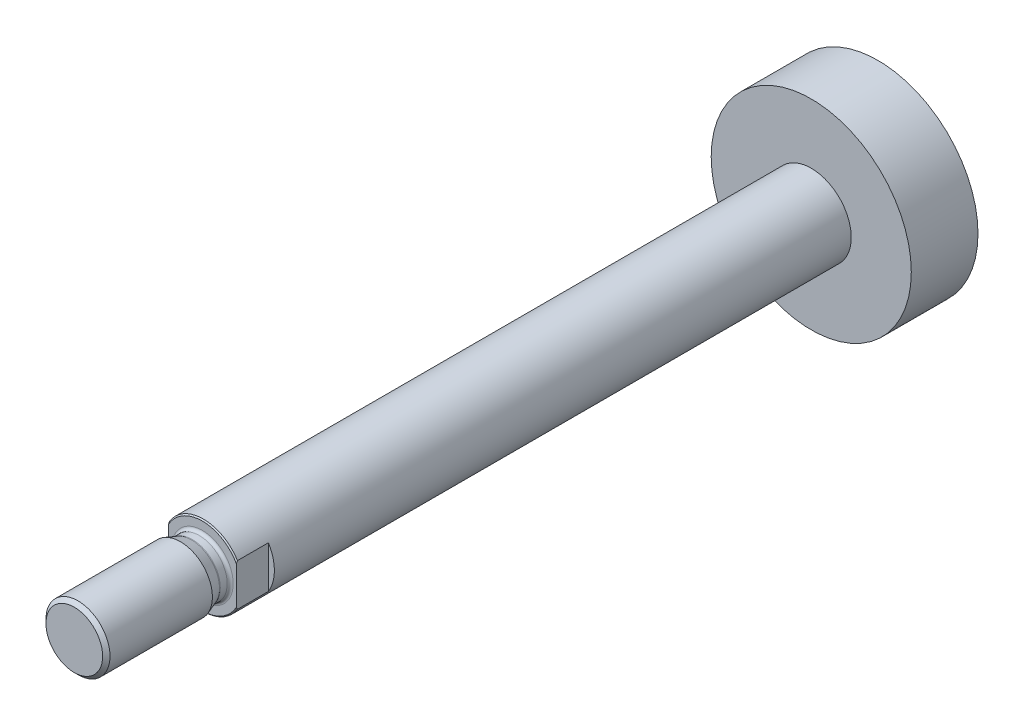
ISO-10303-21;
HEADER;
FILE_DESCRIPTION(('STEP AP214'),'2;1');
FILE_NAME('part.step','',(''),(''),'','','');
FILE_SCHEMA(('AUTOMOTIVE_DESIGN { 1 0 10303 214 1 1 1 1 }'));
ENDSEC;
DATA;
#1=APPLICATION_CONTEXT('core data for automotive mechanical design processes');
#2=APPLICATION_PROTOCOL_DEFINITION('international standard','automotive_design',2000,#1);
#3=PRODUCT_CONTEXT('',#1,'mechanical');
#4=PRODUCT('Part','Part','',(#3));
#5=PRODUCT_RELATED_PRODUCT_CATEGORY('part','',(#4));
#6=PRODUCT_DEFINITION_FORMATION('','',#4);
#7=PRODUCT_DEFINITION_CONTEXT('part definition',#1,'design');
#8=PRODUCT_DEFINITION('design','',#6,#7);
#9=PRODUCT_DEFINITION_SHAPE('','',#8);
#10=(LENGTH_UNIT() NAMED_UNIT(*) SI_UNIT(.MILLI.,.METRE.));
#11=(NAMED_UNIT(*) PLANE_ANGLE_UNIT() SI_UNIT($,.RADIAN.));
#12=(NAMED_UNIT(*) SI_UNIT($,.STERADIAN.) SOLID_ANGLE_UNIT());
#13=UNCERTAINTY_MEASURE_WITH_UNIT(LENGTH_MEASURE(1.E-05),#10,'distance_accuracy_value','');
#14=(GEOMETRIC_REPRESENTATION_CONTEXT(3) GLOBAL_UNCERTAINTY_ASSIGNED_CONTEXT((#13)) GLOBAL_UNIT_ASSIGNED_CONTEXT((#10,
#11,#12)) REPRESENTATION_CONTEXT('',''));
#15=CARTESIAN_POINT('',(0.,0.,0.));
#16=DIRECTION('',(0.,0.,1.));
#17=DIRECTION('',(1.,0.,0.));
#18=AXIS2_PLACEMENT_3D('',#15,#16,#17);
#19=CARTESIAN_POINT('',(0.,0.,35.8));
#20=DIRECTION('',(0.,0.,-1.));
#21=DIRECTION('',(-1.,0.,0.));
#22=AXIS2_PLACEMENT_3D('',#19,#20,#21);
#23=PLANE('',#22);
#24=CARTESIAN_POINT('',(0.,0.,35.8));
#25=DIRECTION('',(0.,0.,1.));
#26=DIRECTION('',(1.,0.,0.));
#27=AXIS2_PLACEMENT_3D('',#24,#25,#26);
#28=CIRCLE('',#27,9.7171572875254);
#29=CARTESIAN_POINT('',(8.5,4.70883698491549,35.8));
#30=VERTEX_POINT('',#29);
#31=CARTESIAN_POINT('',(-8.5,4.70883698491549,35.8));
#32=VERTEX_POINT('',#31);
#33=EDGE_CURVE('E93',#30,#32,#28,.T.);
#34=ORIENTED_EDGE('',*,*,#33,.T.);
#35=DIRECTION('',(0.,-1.,0.));
#36=VECTOR('',#35,1.);
#37=CARTESIAN_POINT('',(-8.5,0.,35.8));
#38=LINE('',#37,#36);
#39=CARTESIAN_POINT('',(-8.5,-4.70883698491549,35.8));
#40=VERTEX_POINT('',#39);
#41=EDGE_CURVE('E135',#32,#40,#38,.T.);
#42=ORIENTED_EDGE('',*,*,#41,.T.);
#43=CARTESIAN_POINT('',(8.5,-4.70883698491549,35.8));
#44=VERTEX_POINT('',#43);
#45=EDGE_CURVE('E123',#40,#44,#28,.T.);
#46=ORIENTED_EDGE('',*,*,#45,.T.);
#47=DIRECTION('',(0.,1.,0.));
#48=VECTOR('',#47,1.);
#49=CARTESIAN_POINT('',(8.5,0.,35.8));
#50=LINE('',#49,#48);
#51=EDGE_CURVE('E137',#44,#30,#50,.T.);
#52=ORIENTED_EDGE('',*,*,#51,.T.);
#53=EDGE_LOOP('',(#34,#42,#46,#52));
#54=FACE_BOUND('',#53,.T.);
#55=CARTESIAN_POINT('',(0.,0.,35.8));
#56=DIRECTION('',(0.,0.,1.));
#57=DIRECTION('',(1.,0.,0.));
#58=AXIS2_PLACEMENT_3D('',#55,#56,#57);
#59=CIRCLE('',#58,7.69999999999987);
#60=CARTESIAN_POINT('',(7.69999999999987,0.,35.8));
#61=VERTEX_POINT('',#60);
#62=EDGE_CURVE('E11',#61,#61,#59,.T.);
#63=ORIENTED_EDGE('',*,*,#62,.F.);
#64=EDGE_LOOP('',(#63));
#65=FACE_BOUND('',#64,.T.);
#66=ADVANCED_FACE('F37',(#54,#65),#23,.F.);
#67=CARTESIAN_POINT('',(0.,0.,35.517157287525));
#68=DIRECTION('',(0.,0.,-1.));
#69=DIRECTION('',(-1.,0.,0.));
#70=AXIS2_PLACEMENT_3D('',#67,#68,#69);
#71=CONICAL_SURFACE('',#70,10.,0.78539816339674);
#72=CARTESIAN_POINT('',(0.,0.,35.517157287525));
#73=DIRECTION('',(0.,0.,1.));
#74=DIRECTION('',(1.,0.,0.));
#75=AXIS2_PLACEMENT_3D('',#72,#73,#74);
#76=CIRCLE('',#75,10.);
#77=CARTESIAN_POINT('',(8.5,5.26782687642637,35.517157287525));
#78=VERTEX_POINT('',#77);
#79=CARTESIAN_POINT('',(-8.5,5.26782687642637,35.517157287525));
#80=VERTEX_POINT('',#79);
#81=EDGE_CURVE('E107',#78,#80,#76,.T.);
#82=ORIENTED_EDGE('',*,*,#81,.T.);
#83=CARTESIAN_POINT('',(-8.5,20.2931416818429,23.515757347519));
#84=CARTESIAN_POINT('',(-8.5,19.9909532321816,23.7944751985551));
#85=CARTESIAN_POINT('',(-8.5,19.6883087592429,24.0726995764812));
#86=CARTESIAN_POINT('',(-8.5,19.0819693919795,24.6280057982693));
#87=CARTESIAN_POINT('',(-8.5,18.7782744897062,24.9050876334509));
#88=CARTESIAN_POINT('',(-8.5,18.1696326441628,25.4580105647202));
#89=CARTESIAN_POINT('',(-8.5,17.8646854369076,25.7338513704878));
#90=CARTESIAN_POINT('',(-8.5,17.2534360991885,26.2840248711402));
#91=CARTESIAN_POINT('',(-8.5,16.9471339714415,26.5583575690466));
#92=CARTESIAN_POINT('',(-8.5,16.022231094719,27.3820416740625));
#93=CARTESIAN_POINT('',(-8.5,15.4012748222079,27.9287620268451));
#94=CARTESIAN_POINT('',(-8.5,14.4635790899891,28.7415486402703));
#95=CARTESIAN_POINT('',(-8.5,14.1499869172972,29.0112478932061));
#96=CARTESIAN_POINT('',(-8.5,13.5203299168492,29.5477463030765));
#97=CARTESIAN_POINT('',(-8.5,13.2042651003595,29.814545473212));
#98=CARTESIAN_POINT('',(-8.5,12.6297734485833,30.2941094729629));
#99=CARTESIAN_POINT('',(-8.5,12.3718491936014,30.507476120676));
#100=CARTESIAN_POINT('',(-8.5,11.8538066740541,30.9315279775631));
#101=CARTESIAN_POINT('',(-8.5,11.5936884275092,31.1422132087254));
#102=CARTESIAN_POINT('',(-8.5,11.0708475228822,31.5604725773241));
#103=CARTESIAN_POINT('',(-8.5,10.8081242003524,31.7680458852602));
#104=CARTESIAN_POINT('',(-8.5,10.2797334506629,32.1794132002756));
#105=CARTESIAN_POINT('',(-8.5,10.0140660451895,32.3832072351634));
#106=CARTESIAN_POINT('',(-8.5,9.47958475304092,32.7860262182236));
#107=CARTESIAN_POINT('',(-8.5,9.21077459368648,32.9850561016856));
#108=CARTESIAN_POINT('',(-8.5,8.66912744527886,33.3775966541487));
#109=CARTESIAN_POINT('',(-8.5,8.39629029886536,33.571107106599));
#110=CARTESIAN_POINT('',(-8.5,7.84601626840109,33.9512419480706));
#111=CARTESIAN_POINT('',(-8.5,7.56858139513418,34.1378692379163));
#112=CARTESIAN_POINT('',(-8.5,7.00820580406143,34.5026353654442));
#113=CARTESIAN_POINT('',(-8.5,6.72526571129147,34.6807751589265));
#114=CARTESIAN_POINT('',(-8.5,6.15594369522947,35.0245556092062));
#115=CARTESIAN_POINT('',(-8.5,5.86963011329933,35.1903088027741));
#116=CARTESIAN_POINT('',(-8.5,5.28964170919473,35.5085847634925));
#117=CARTESIAN_POINT('',(-8.5,4.99596607971788,35.6611060714174));
#118=CARTESIAN_POINT('',(-8.5,4.40060972911149,35.9491091194768));
#119=CARTESIAN_POINT('',(-8.5,4.09893609408879,36.0846053703257));
#120=CARTESIAN_POINT('',(-8.5,3.48675946894252,36.3340497452572));
#121=CARTESIAN_POINT('',(-8.5,3.17625906988089,36.4480041192478));
#122=CARTESIAN_POINT('',(-8.5,2.61483993494601,36.6271172168644));
#123=CARTESIAN_POINT('',(-8.5,2.36559695435784,36.6974987360869));
#124=CARTESIAN_POINT('',(-8.5,1.86241147061954,36.8189376790285));
#125=CARTESIAN_POINT('',(-8.5,1.60846958490582,36.8699976229546));
#126=CARTESIAN_POINT('',(-8.5,1.09789808538753,36.9502405878037));
#127=CARTESIAN_POINT('',(-8.5,0.841279054154406,36.9794899738951));
#128=CARTESIAN_POINT('',(-8.5,0.326434251534695,37.0147672549925));
#129=CARTESIAN_POINT('',(-8.5,0.0682085522656415,37.0207961848559));
#130=CARTESIAN_POINT('',(-8.5,-0.448145416818584,37.0092732790622));
#131=CARTESIAN_POINT('',(-8.5,-0.70627278006227,36.9916814678556));
#132=CARTESIAN_POINT('',(-8.5,-1.21995794283295,36.933852765241));
#133=CARTESIAN_POINT('',(-8.5,-1.47551552737386,36.8936139949842));
#134=CARTESIAN_POINT('',(-8.5,-1.98325104270918,36.7924134805502));
#135=CARTESIAN_POINT('',(-8.5,-2.23541619910096,36.7313885363896));
#136=CARTESIAN_POINT('',(-8.5,-2.73462740984317,36.5913102607832));
#137=CARTESIAN_POINT('',(-8.5,-2.98167333960936,36.512256491139));
#138=CARTESIAN_POINT('',(-8.5,-3.50843039200757,36.3253505755926));
#139=CARTESIAN_POINT('',(-8.5,-3.78722327825603,36.214929559187));
#140=CARTESIAN_POINT('',(-8.5,-4.3377344352971,35.9775449304102));
#141=CARTESIAN_POINT('',(-8.5,-4.60944947813715,35.8505739233482));
#142=CARTESIAN_POINT('',(-8.5,-5.14670936977727,35.5831632290464));
#143=CARTESIAN_POINT('',(-8.5,-5.41224263972401,35.442700453981));
#144=CARTESIAN_POINT('',(-8.5,-5.93732373883573,35.1511479577253));
#145=CARTESIAN_POINT('',(-8.5,-6.19687237682952,35.0000596838929));
#146=CARTESIAN_POINT('',(-8.5,-6.71387938945896,34.6874165964138));
#147=CARTESIAN_POINT('',(-8.5,-6.97127405537464,34.5257569209253));
#148=CARTESIAN_POINT('',(-8.5,-7.48143909140267,34.1953123208713));
#149=CARTESIAN_POINT('',(-8.5,-7.73420934795835,34.0265272216701));
#150=CARTESIAN_POINT('',(-8.5,-8.23548894286409,33.6833095797488));
#151=CARTESIAN_POINT('',(-8.5,-8.48400243239181,33.50888308204));
#152=CARTESIAN_POINT('',(-8.5,-8.97759015318394,33.1552198479554));
#153=CARTESIAN_POINT('',(-8.5,-9.22266424062535,32.9759829113324));
#154=CARTESIAN_POINT('',(-8.5,-9.71078642617633,32.6127907239817));
#155=CARTESIAN_POINT('',(-8.5,-9.95382274811321,32.4288196744052));
#156=CARTESIAN_POINT('',(-8.5,-10.4372856320122,32.0574761238702));
#157=CARTESIAN_POINT('',(-8.5,-10.6777121405458,31.8701035534842));
#158=CARTESIAN_POINT('',(-8.5,-11.3956270119042,31.3036586987104));
#159=CARTESIAN_POINT('',(-8.5,-11.869720195856,30.9202821895857));
#160=CARTESIAN_POINT('',(-8.5,-12.8113091720547,30.1448280086789));
#161=CARTESIAN_POINT('',(-8.5,-13.2787996354372,29.7527438999839));
#162=CARTESIAN_POINT('',(-8.5,-14.208345382449,28.9621780256675));
#163=CARTESIAN_POINT('',(-8.5,-14.6704005643826,28.5636961406705));
#164=CARTESIAN_POINT('',(-8.5,-15.5669685578594,27.7820273007353));
#165=CARTESIAN_POINT('',(-8.5,-16.0016941293626,27.3990838847463));
#166=CARTESIAN_POINT('',(-8.5,-16.8679762920894,26.6296198506874));
#167=CARTESIAN_POINT('',(-8.5,-17.2995328365647,26.2430991800366));
#168=CARTESIAN_POINT('',(-8.5,-18.1593436587441,25.4677882494832));
#169=CARTESIAN_POINT('',(-8.5,-18.5876021265765,25.0790026310551));
#170=CARTESIAN_POINT('',(-8.5,-19.4419161824545,24.2990487562217));
#171=CARTESIAN_POINT('',(-8.5,-19.8679718499217,23.9078805868421));
#172=CARTESIAN_POINT('',(-8.5,-20.2931416818429,23.515757347519));
#173=B_SPLINE_CURVE_WITH_KNOTS('',3,(#83,#84,#85,#86,#87,#88,#89,#90,#91,#92,#93,#94,#95,#96,
#97,#98,#99,#100,#101,#102,#103,#104,#105,#106,#107,#108,#109,#110,#111,#112,#113,#114,#115,
#116,#117,#118,#119,#120,#121,#122,#123,#124,#125,#126,#127,#128,#129,#130,#131,#132,#133,#134,
#135,#136,#137,#138,#139,#140,#141,#142,#143,#144,#145,#146,#147,#148,#149,#150,#151,#152,#153,
#154,#155,#156,#157,#158,#159,#160,#161,#162,#163,#164,#165,#166,#167,#168,#169,#170,#171,#172),
.UNSPECIFIED.,.F.,.F.,(4,2,2,2,2,2,2,2,2,2,2,2,2,2,2,2,2,2,2,2,2,2,2,2,2,2,2,2,2,2,2,2,2,2,2,2,
2,2,2,2,2,2,2,2,4),(0.,1.23329407253443,2.46659749779148,3.70017581984493,4.93375166947324,
7.41567899242222,8.65651239378964,9.89734014467006,10.9015425300175,11.9057366753115,
12.9101938980808,13.9146437269081,14.9180035554603,15.9214026960937,16.9243740186242,
17.9272321255532,18.9194528406654,19.9117828401383,20.9032612403211,21.894451541599,
22.6707670326658,23.4469812301961,24.220823815752,24.9946319133493,25.7697512494663,
26.54493490092,27.3224968404886,28.1000776810491,28.9989943325069,29.8983140140338,
30.7992010482207,31.6999656044036,32.6116741068261,33.5234049671282,34.4341892823292,
35.3450115703387,36.2594200447435,37.1738472038835,39.0028160017244,40.8331850617722,
42.6635883142871,44.4015778846082,46.1395930417847,47.8748171514288,49.6099782553031),.UNSPECIFIED.);
#174=EDGE_CURVE('E120',#80,#32,#173,.T.);
#175=ORIENTED_EDGE('',*,*,#174,.T.);
#176=ORIENTED_EDGE('',*,*,#33,.F.);
#177=CARTESIAN_POINT('',(8.5,-20.2931416818428,23.515757347519));
#178=CARTESIAN_POINT('',(8.5,-19.9909532321816,23.7944751985551));
#179=CARTESIAN_POINT('',(8.5,-19.6883087592429,24.0726995764812));
#180=CARTESIAN_POINT('',(8.5,-19.0819693919795,24.6280057982693));
#181=CARTESIAN_POINT('',(8.5,-18.7782744897062,24.9050876334509));
#182=CARTESIAN_POINT('',(8.5,-18.1696326441628,25.4580105647202));
#183=CARTESIAN_POINT('',(8.5,-17.8646854369076,25.7338513704878));
#184=CARTESIAN_POINT('',(8.5,-17.2534360991885,26.2840248711402));
#185=CARTESIAN_POINT('',(8.5,-16.9471339714415,26.5583575690466));
#186=CARTESIAN_POINT('',(8.5,-16.022231094719,27.3820416740625));
#187=CARTESIAN_POINT('',(8.5,-15.4012748222079,27.9287620268451));
#188=CARTESIAN_POINT('',(8.5,-14.4635790899891,28.7415486402703));
#189=CARTESIAN_POINT('',(8.5,-14.1499869172972,29.0112478932061));
#190=CARTESIAN_POINT('',(8.5,-13.5203299168492,29.5477463030765));
#191=CARTESIAN_POINT('',(8.5,-13.2042651003595,29.814545473212));
#192=CARTESIAN_POINT('',(8.5,-12.6297734485833,30.2941094729629));
#193=CARTESIAN_POINT('',(8.5,-12.3718491936014,30.507476120676));
#194=CARTESIAN_POINT('',(8.5,-11.8538066740541,30.9315279775631));
#195=CARTESIAN_POINT('',(8.5,-11.5936884275093,31.1422132087254));
#196=CARTESIAN_POINT('',(8.5,-11.0708475228822,31.560472577324));
#197=CARTESIAN_POINT('',(8.5,-10.8081242003524,31.7680458852602));
#198=CARTESIAN_POINT('',(8.5,-10.279733450663,32.1794132002755));
#199=CARTESIAN_POINT('',(8.5,-10.0140660451895,32.3832072351633));
#200=CARTESIAN_POINT('',(8.5,-9.47958475304094,32.7860262182236));
#201=CARTESIAN_POINT('',(8.5,-9.2107745936865,32.9850561016856));
#202=CARTESIAN_POINT('',(8.5,-8.66912744527887,33.3775966541487));
#203=CARTESIAN_POINT('',(8.5,-8.39629029886538,33.571107106599));
#204=CARTESIAN_POINT('',(8.5,-7.84601626840112,33.9512419480706));
#205=CARTESIAN_POINT('',(8.5,-7.56858139513421,34.1378692379163));
#206=CARTESIAN_POINT('',(8.5,-7.00820580406146,34.5026353654441));
#207=CARTESIAN_POINT('',(8.5,-6.7252657112915,34.6807751589265));
#208=CARTESIAN_POINT('',(8.5,-6.15594369522951,35.0245556092062));
#209=CARTESIAN_POINT('',(8.5,-5.86963011329937,35.1903088027741));
#210=CARTESIAN_POINT('',(8.5,-5.28964170919476,35.5085847634925));
#211=CARTESIAN_POINT('',(8.5,-4.99596607971791,35.6611060714174));
#212=CARTESIAN_POINT('',(8.5,-4.40060972911151,35.9491091194768));
#213=CARTESIAN_POINT('',(8.5,-4.09893609408881,36.0846053703257));
#214=CARTESIAN_POINT('',(8.5,-3.48675946894254,36.3340497452572));
#215=CARTESIAN_POINT('',(8.5,-3.17625906988091,36.4480041192478));
#216=CARTESIAN_POINT('',(8.5,-2.61483993494603,36.6271172168644));
#217=CARTESIAN_POINT('',(8.5,-2.36559695435785,36.6974987360869));
#218=CARTESIAN_POINT('',(8.5,-1.86241147061956,36.8189376790285));
#219=CARTESIAN_POINT('',(8.5,-1.60846958490584,36.8699976229546));
#220=CARTESIAN_POINT('',(8.5,-1.09789808538755,36.9502405878037));
#221=CARTESIAN_POINT('',(8.5,-0.841279054154421,36.9794899738951));
#222=CARTESIAN_POINT('',(8.5,-0.326434251534708,37.0147672549924));
#223=CARTESIAN_POINT('',(8.5,-0.0682085522656554,37.0207961848559));
#224=CARTESIAN_POINT('',(8.5,0.448145416818571,37.0092732790622));
#225=CARTESIAN_POINT('',(8.5,0.706272780062258,36.9916814678556));
#226=CARTESIAN_POINT('',(8.5,1.21995794283294,36.933852765241));
#227=CARTESIAN_POINT('',(8.5,1.47551552737385,36.8936139949842));
#228=CARTESIAN_POINT('',(8.5,1.98325104270917,36.7924134805502));
#229=CARTESIAN_POINT('',(8.5,2.23541619910094,36.7313885363896));
#230=CARTESIAN_POINT('',(8.5,2.73462740984316,36.5913102607832));
#231=CARTESIAN_POINT('',(8.5,2.98167333960935,36.512256491139));
#232=CARTESIAN_POINT('',(8.5,3.50843039200756,36.3253505755926));
#233=CARTESIAN_POINT('',(8.5,3.78722327825601,36.214929559187));
#234=CARTESIAN_POINT('',(8.5,4.33773443529708,35.9775449304102));
#235=CARTESIAN_POINT('',(8.5,4.60944947813713,35.8505739233482));
#236=CARTESIAN_POINT('',(8.5,5.14670936977725,35.5831632290464));
#237=CARTESIAN_POINT('',(8.5,5.412242639724,35.4427004539811));
#238=CARTESIAN_POINT('',(8.5,5.93732373883572,35.1511479577253));
#239=CARTESIAN_POINT('',(8.5,6.1968723768295,35.000059683893));
#240=CARTESIAN_POINT('',(8.5,6.71387938945894,34.6874165964138));
#241=CARTESIAN_POINT('',(8.5,6.97127405537462,34.5257569209253));
#242=CARTESIAN_POINT('',(8.5,7.48143909140265,34.1953123208713));
#243=CARTESIAN_POINT('',(8.5,7.73420934795833,34.0265272216701));
#244=CARTESIAN_POINT('',(8.5,8.23548894286407,33.6833095797489));
#245=CARTESIAN_POINT('',(8.5,8.48400243239178,33.50888308204));
#246=CARTESIAN_POINT('',(8.5,8.97759015318391,33.1552198479554));
#247=CARTESIAN_POINT('',(8.5,9.22266424062532,32.9759829113324));
#248=CARTESIAN_POINT('',(8.5,9.7107864261763,32.6127907239817));
#249=CARTESIAN_POINT('',(8.5,9.95382274811318,32.4288196744052));
#250=CARTESIAN_POINT('',(8.5,10.4372856320122,32.0574761238702));
#251=CARTESIAN_POINT('',(8.5,10.6777121405458,31.8701035534843));
#252=CARTESIAN_POINT('',(8.5,11.3956270119042,31.3036586987104));
#253=CARTESIAN_POINT('',(8.5,11.869720195856,30.9202821895857));
#254=CARTESIAN_POINT('',(8.5,12.8113091720547,30.1448280086789));
#255=CARTESIAN_POINT('',(8.5,13.2787996354371,29.7527438999839));
#256=CARTESIAN_POINT('',(8.5,14.208345382449,28.9621780256675));
#257=CARTESIAN_POINT('',(8.5,14.6704005643825,28.5636961406705));
#258=CARTESIAN_POINT('',(8.5,15.5669685578594,27.7820273007354));
#259=CARTESIAN_POINT('',(8.5,16.0016941293626,27.3990838847463));
#260=CARTESIAN_POINT('',(8.5,16.8679762920894,26.6296198506874));
#261=CARTESIAN_POINT('',(8.5,17.2995328365647,26.2430991800366));
#262=CARTESIAN_POINT('',(8.5,18.1593436587441,25.4677882494832));
#263=CARTESIAN_POINT('',(8.5,18.5876021265765,25.0790026310551));
#264=CARTESIAN_POINT('',(8.5,19.4419161824545,24.2990487562217));
#265=CARTESIAN_POINT('',(8.5,19.8679718499217,23.9078805868421));
#266=CARTESIAN_POINT('',(8.5,20.2931416818429,23.515757347519));
#267=B_SPLINE_CURVE_WITH_KNOTS('',3,(#177,#178,#179,#180,#181,#182,#183,#184,#185,#186,#187,
#188,#189,#190,#191,#192,#193,#194,#195,#196,#197,#198,#199,#200,#201,#202,#203,#204,#205,#206,
#207,#208,#209,#210,#211,#212,#213,#214,#215,#216,#217,#218,#219,#220,#221,#222,#223,#224,#225,
#226,#227,#228,#229,#230,#231,#232,#233,#234,#235,#236,#237,#238,#239,#240,#241,#242,#243,#244,
#245,#246,#247,#248,#249,#250,#251,#252,#253,#254,#255,#256,#257,#258,#259,#260,#261,#262,#263,
#264,#265,#266),.UNSPECIFIED.,.F.,.F.,(4,2,2,2,2,2,2,2,2,2,2,2,2,2,2,2,2,2,2,2,2,2,2,2,2,2,2,2,
2,2,2,2,2,2,2,2,2,2,2,2,2,2,2,2,4),(0.,1.23329407253443,2.46659749779148,3.70017581984493,
4.93375166947324,7.41567899242221,8.65651239378964,9.89734014467005,10.9015425300175,
11.9057366753115,12.9101938980808,13.9146437269081,14.9180035554602,15.9214026960937,
16.9243740186241,17.9272321255531,18.9194528406654,19.9117828401383,20.9032612403211,
21.894451541599,22.6707670326657,23.4469812301961,24.220823815752,24.9946319133493,
25.7697512494663,26.54493490092,27.3224968404885,28.1000776810491,28.9989943325069,
29.8983140140337,30.7992010482207,31.6999656044036,32.6116741068261,33.5234049671282,
34.4341892823292,35.3450115703386,36.2594200447435,37.1738472038834,39.0028160017243,
40.8331850617722,42.6635883142871,44.4015778846081,46.1395930417847,47.8748171514288,
49.6099782553031),.UNSPECIFIED.);
#268=EDGE_CURVE('E122',#30,#78,#267,.T.);
#269=ORIENTED_EDGE('',*,*,#268,.T.);
#270=EDGE_LOOP('',(#82,#175,#176,#269));
#271=FACE_BOUND('',#270,.T.);
#272=ADVANCED_FACE('F118',(#271),#71,.T.);
#273=ORIENTED_EDGE('',*,*,#45,.F.);
#274=CARTESIAN_POINT('',(-8.5,-5.26782687642637,35.517157287525));
#275=VERTEX_POINT('',#274);
#276=EDGE_CURVE('E141',#40,#275,#173,.T.);
#277=ORIENTED_EDGE('',*,*,#276,.T.);
#278=CARTESIAN_POINT('',(8.5,-5.26782687642637,35.517157287525));
#279=VERTEX_POINT('',#278);
#280=EDGE_CURVE('E124',#275,#279,#76,.T.);
#281=ORIENTED_EDGE('',*,*,#280,.T.);
#282=EDGE_CURVE('E139',#279,#44,#267,.T.);
#283=ORIENTED_EDGE('',*,*,#282,.T.);
#284=EDGE_LOOP('',(#273,#277,#281,#283));
#285=FACE_BOUND('',#284,.T.);
#286=ADVANCED_FACE('F155',(#285),#71,.T.);
#287=CARTESIAN_POINT('',(0.,0.,-133.));
#288=DIRECTION('',(0.,0.,1.));
#289=DIRECTION('',(1.,0.,0.));
#290=AXIS2_PLACEMENT_3D('',#287,#288,#289);
#291=CYLINDRICAL_SURFACE('',#290,10.);
#292=CARTESIAN_POINT('',(0.,0.,27.8));
#293=DIRECTION('',(0.,0.,-1.));
#294=DIRECTION('',(-1.,0.,0.));
#295=AXIS2_PLACEMENT_3D('',#292,#293,#294);
#296=CIRCLE('',#295,10.);
#297=CARTESIAN_POINT('',(-8.5,-5.26782687642637,27.8));
#298=VERTEX_POINT('',#297);
#299=CARTESIAN_POINT('',(-8.5,5.26782687642637,27.8));
#300=VERTEX_POINT('',#299);
#301=EDGE_CURVE('E115',#298,#300,#296,.T.);
#302=ORIENTED_EDGE('',*,*,#301,.T.);
#303=DIRECTION('',(0.,0.,1.));
#304=VECTOR('',#303,1.);
#305=CARTESIAN_POINT('',(-8.5,5.26782687642637,-133.));
#306=LINE('',#305,#304);
#307=EDGE_CURVE('E44',#300,#80,#306,.T.);
#308=ORIENTED_EDGE('',*,*,#307,.T.);
#309=ORIENTED_EDGE('',*,*,#81,.F.);
#310=DIRECTION('',(0.,0.,1.));
#311=VECTOR('',#310,1.);
#312=CARTESIAN_POINT('',(8.5,5.26782687642637,-133.));
#313=LINE('',#312,#311);
#314=CARTESIAN_POINT('',(8.5,5.26782687642637,27.8));
#315=VERTEX_POINT('',#314);
#316=EDGE_CURVE('E92',#78,#315,#313,.F.);
#317=ORIENTED_EDGE('',*,*,#316,.T.);
#318=CARTESIAN_POINT('',(0.,0.,27.8));
#319=DIRECTION('',(0.,0.,-1.));
#320=DIRECTION('',(-1.,0.,0.));
#321=AXIS2_PLACEMENT_3D('',#318,#319,#320);
#322=CIRCLE('',#321,10.);
#323=CARTESIAN_POINT('',(8.5,-5.26782687642637,27.8));
#324=VERTEX_POINT('',#323);
#325=EDGE_CURVE('E87',#315,#324,#322,.T.);
#326=ORIENTED_EDGE('',*,*,#325,.T.);
#327=DIRECTION('',(0.,0.,1.));
#328=VECTOR('',#327,1.);
#329=CARTESIAN_POINT('',(8.5,-5.26782687642637,-133.));
#330=LINE('',#329,#328);
#331=EDGE_CURVE('E98',#324,#279,#330,.T.);
#332=ORIENTED_EDGE('',*,*,#331,.T.);
#333=ORIENTED_EDGE('',*,*,#280,.F.);
#334=DIRECTION('',(0.,0.,1.));
#335=VECTOR('',#334,1.);
#336=CARTESIAN_POINT('',(-8.5,-5.26782687642637,-133.));
#337=LINE('',#336,#335);
#338=EDGE_CURVE('E109',#275,#298,#337,.F.);
#339=ORIENTED_EDGE('',*,*,#338,.T.);
#340=EDGE_LOOP('',(#302,#308,#309,#317,#326,#332,#333,#339));
#341=FACE_BOUND('',#340,.T.);
#342=CARTESIAN_POINT('',(0.,0.,-116.33333333333));
#343=DIRECTION('',(0.,0.,1.));
#344=DIRECTION('',(1.,0.,0.));
#345=AXIS2_PLACEMENT_3D('',#342,#343,#344);
#346=CIRCLE('',#345,10.);
#347=CARTESIAN_POINT('',(10.,0.,-116.33333333333));
#348=VERTEX_POINT('',#347);
#349=EDGE_CURVE('E128',#348,#348,#346,.T.);
#350=ORIENTED_EDGE('',*,*,#349,.T.);
#351=EDGE_LOOP('',(#350));
#352=FACE_BOUND('',#351,.T.);
#353=ADVANCED_FACE('F103',(#341,#352),#291,.T.);
#354=CARTESIAN_POINT('',(0.,10.,-116.33333333333));
#355=DIRECTION('',(0.,0.,-1.));
#356=DIRECTION('',(-1.,0.,0.));
#357=AXIS2_PLACEMENT_3D('',#354,#355,#356);
#358=PLANE('',#357);
#359=ORIENTED_EDGE('',*,*,#349,.F.);
#360=EDGE_LOOP('',(#359));
#361=FACE_BOUND('',#360,.T.);
#362=CARTESIAN_POINT('',(0.,0.,-116.33333333333));
#363=DIRECTION('',(0.,0.,1.));
#364=DIRECTION('',(1.,0.,0.));
#365=AXIS2_PLACEMENT_3D('',#362,#363,#364);
#366=CIRCLE('',#365,25.);
#367=CARTESIAN_POINT('',(25.,0.,-116.33333333333));
#368=VERTEX_POINT('',#367);
#369=EDGE_CURVE('E381',#368,#368,#366,.T.);
#370=ORIENTED_EDGE('',*,*,#369,.T.);
#371=EDGE_LOOP('',(#370));
#372=FACE_BOUND('',#371,.T.);
#373=ADVANCED_FACE('F177',(#361,#372),#358,.F.);
#374=CARTESIAN_POINT('',(0.,0.,-133.));
#375=DIRECTION('',(0.,0.,1.));
#376=DIRECTION('',(1.,0.,0.));
#377=AXIS2_PLACEMENT_3D('',#374,#375,#376);
#378=CYLINDRICAL_SURFACE('',#377,25.);
#379=ORIENTED_EDGE('',*,*,#369,.F.);
#380=EDGE_LOOP('',(#379));
#381=FACE_BOUND('',#380,.T.);
#382=CARTESIAN_POINT('',(0.,0.,-133.));
#383=DIRECTION('',(0.,0.,1.));
#384=DIRECTION('',(1.,0.,0.));
#385=AXIS2_PLACEMENT_3D('',#382,#383,#384);
#386=CIRCLE('',#385,25.);
#387=CARTESIAN_POINT('',(25.,0.,-133.));
#388=VERTEX_POINT('',#387);
#389=EDGE_CURVE('E379',#388,#388,#386,.T.);
#390=ORIENTED_EDGE('',*,*,#389,.T.);
#391=EDGE_LOOP('',(#390));
#392=FACE_BOUND('',#391,.T.);
#393=ADVANCED_FACE('F173',(#381,#392),#378,.T.);
#394=CARTESIAN_POINT('',(0.,25.,-133.));
#395=DIRECTION('',(0.,0.,1.));
#396=DIRECTION('',(1.,0.,0.));
#397=AXIS2_PLACEMENT_3D('',#394,#395,#396);
#398=PLANE('',#397);
#399=ORIENTED_EDGE('',*,*,#389,.F.);
#400=EDGE_LOOP('',(#399));
#401=FACE_BOUND('',#400,.T.);
#402=ADVANCED_FACE('F170',(#401),#398,.F.);
#403=CARTESIAN_POINT('',(17.,-17.,27.8));
#404=DIRECTION('',(0.,0.,-1.));
#405=DIRECTION('',(-1.,0.,0.));
#406=AXIS2_PLACEMENT_3D('',#403,#404,#405);
#407=PLANE('',#406);
#408=DIRECTION('',(0.,1.,0.));
#409=VECTOR('',#408,1.);
#410=CARTESIAN_POINT('',(8.5,-17.,27.8));
#411=LINE('',#410,#409);
#412=EDGE_CURVE('E58',#324,#315,#411,.T.);
#413=ORIENTED_EDGE('',*,*,#412,.F.);
#414=ORIENTED_EDGE('',*,*,#325,.F.);
#415=EDGE_LOOP('',(#413,#414));
#416=FACE_BOUND('',#415,.T.);
#417=ADVANCED_FACE('F88',(#416),#407,.F.);
#418=CARTESIAN_POINT('',(8.5,-17.,27.8));
#419=DIRECTION('',(-1.,0.,0.));
#420=DIRECTION('',(0.,0.,1.));
#421=AXIS2_PLACEMENT_3D('',#418,#419,#420);
#422=PLANE('',#421);
#423=ORIENTED_EDGE('',*,*,#412,.T.);
#424=ORIENTED_EDGE('',*,*,#316,.F.);
#425=ORIENTED_EDGE('',*,*,#268,.F.);
#426=ORIENTED_EDGE('',*,*,#51,.F.);
#427=ORIENTED_EDGE('',*,*,#282,.F.);
#428=ORIENTED_EDGE('',*,*,#331,.F.);
#429=EDGE_LOOP('',(#423,#424,#425,#426,#427,#428));
#430=FACE_BOUND('',#429,.T.);
#431=ADVANCED_FACE('F96',(#430),#422,.F.);
#432=CARTESIAN_POINT('',(-8.5,-17.,27.8));
#433=DIRECTION('',(0.,0.,-1.));
#434=DIRECTION('',(-1.,0.,0.));
#435=AXIS2_PLACEMENT_3D('',#432,#433,#434);
#436=PLANE('',#435);
#437=DIRECTION('',(0.,1.,0.));
#438=VECTOR('',#437,1.);
#439=CARTESIAN_POINT('',(-8.5,-17.,27.8));
#440=LINE('',#439,#438);
#441=EDGE_CURVE('E51',#298,#300,#440,.T.);
#442=ORIENTED_EDGE('',*,*,#441,.T.);
#443=ORIENTED_EDGE('',*,*,#301,.F.);
#444=EDGE_LOOP('',(#442,#443));
#445=FACE_BOUND('',#444,.T.);
#446=ADVANCED_FACE('F163',(#445),#436,.F.);
#447=CARTESIAN_POINT('',(-8.5,-17.,43.8));
#448=DIRECTION('',(1.,0.,0.));
#449=DIRECTION('',(0.,0.,-1.));
#450=AXIS2_PLACEMENT_3D('',#447,#448,#449);
#451=PLANE('',#450);
#452=ORIENTED_EDGE('',*,*,#441,.F.);
#453=ORIENTED_EDGE('',*,*,#338,.F.);
#454=ORIENTED_EDGE('',*,*,#276,.F.);
#455=ORIENTED_EDGE('',*,*,#41,.F.);
#456=ORIENTED_EDGE('',*,*,#174,.F.);
#457=ORIENTED_EDGE('',*,*,#307,.F.);
#458=EDGE_LOOP('',(#452,#453,#454,#455,#456,#457));
#459=FACE_BOUND('',#458,.T.);
#460=ADVANCED_FACE('F158',(#459),#451,.F.);
#461=CARTESIAN_POINT('',(0.,0.,36.5499999999999));
#462=DIRECTION('',(0.,0.,1.));
#463=DIRECTION('',(1.,0.,0.));
#464=AXIS2_PLACEMENT_3D('',#461,#462,#463);
#465=TOROIDAL_SURFACE('',#464,7.69999999999987,0.749999999999868);
#466=CARTESIAN_POINT('',(0.,0.,36.55));
#467=DIRECTION('',(0.,0.,1.));
#468=DIRECTION('',(1.,0.,0.));
#469=AXIS2_PLACEMENT_3D('',#466,#467,#468);
#470=CIRCLE('',#469,6.95);
#471=CARTESIAN_POINT('',(6.95,0.,36.55));
#472=VERTEX_POINT('',#471);
#473=EDGE_CURVE('E99',#472,#472,#470,.T.);
#474=ORIENTED_EDGE('',*,*,#473,.F.);
#475=EDGE_LOOP('',(#474));
#476=FACE_BOUND('',#475,.T.);
#477=ORIENTED_EDGE('',*,*,#62,.T.);
#478=EDGE_LOOP('',(#477));
#479=FACE_BOUND('',#478,.T.);
#480=ADVANCED_FACE('F162',(#476,#479),#465,.F.);
#481=CARTESIAN_POINT('',(0.,0.,35.05));
#482=DIRECTION('',(0.,0.,1.));
#483=DIRECTION('',(1.,0.,0.));
#484=AXIS2_PLACEMENT_3D('',#481,#482,#483);
#485=CYLINDRICAL_SURFACE('',#484,6.95);
#486=CARTESIAN_POINT('',(0.,0.,38.267754764469));
#487=DIRECTION('',(0.,0.,1.));
#488=DIRECTION('',(1.,0.,0.));
#489=AXIS2_PLACEMENT_3D('',#486,#487,#488);
#490=CIRCLE('',#489,6.95);
#491=CARTESIAN_POINT('',(6.95,0.,38.267754764469));
#492=VERTEX_POINT('',#491);
#493=EDGE_CURVE('E373',#492,#492,#490,.T.);
#494=ORIENTED_EDGE('',*,*,#493,.F.);
#495=EDGE_LOOP('',(#494));
#496=FACE_BOUND('',#495,.T.);
#497=ORIENTED_EDGE('',*,*,#473,.T.);
#498=EDGE_LOOP('',(#497));
#499=FACE_BOUND('',#498,.T.);
#500=ADVANCED_FACE('F221',(#496,#499),#485,.T.);
#501=CARTESIAN_POINT('',(0.,0.,38.2677547644694));
#502=DIRECTION('',(0.,0.,1.));
#503=DIRECTION('',(1.,0.,0.));
#504=AXIS2_PLACEMENT_3D('',#501,#502,#503);
#505=TOROIDAL_SURFACE('',#504,7.69999999999571,0.74999999999571);
#506=CARTESIAN_POINT('',(0.,0.,38.5242698719622));
#507=DIRECTION('',(0.,0.,1.));
#508=DIRECTION('',(1.,0.,0.));
#509=AXIS2_PLACEMENT_3D('',#506,#507,#508);
#510=CIRCLE('',#509,6.99523053441032);
#511=CARTESIAN_POINT('',(6.99523053441032,0.,38.5242698719622));
#512=VERTEX_POINT('',#511);
#513=EDGE_CURVE('E370',#512,#512,#510,.T.);
#514=ORIENTED_EDGE('',*,*,#513,.F.);
#515=EDGE_LOOP('',(#514));
#516=FACE_BOUND('',#515,.T.);
#517=ORIENTED_EDGE('',*,*,#493,.T.);
#518=EDGE_LOOP('',(#517));
#519=FACE_BOUND('',#518,.T.);
#520=ADVANCED_FACE('F211',(#516,#519),#505,.F.);
#521=CARTESIAN_POINT('',(0.,0.,38.5242698719622));
#522=DIRECTION('',(0.,0.,1.));
#523=DIRECTION('',(1.,0.,0.));
#524=AXIS2_PLACEMENT_3D('',#521,#522,#523);
#525=CONICAL_SURFACE('',#524,6.99523053441032,0.349065850398908);
#526=CARTESIAN_POINT('',(0.,0.,41.284851290427));
#527=DIRECTION('',(0.,0.,1.));
#528=DIRECTION('',(1.,0.,0.));
#529=AXIS2_PLACEMENT_3D('',#526,#527,#528);
#530=CIRCLE('',#529,8.);
#531=CARTESIAN_POINT('',(8.,0.,41.284851290427));
#532=VERTEX_POINT('',#531);
#533=EDGE_CURVE('E365',#532,#532,#530,.T.);
#534=ORIENTED_EDGE('',*,*,#533,.F.);
#535=EDGE_LOOP('',(#534));
#536=FACE_BOUND('',#535,.T.);
#537=ORIENTED_EDGE('',*,*,#513,.T.);
#538=EDGE_LOOP('',(#537));
#539=FACE_BOUND('',#538,.T.);
#540=ADVANCED_FACE('F205',(#536,#539),#525,.T.);
#541=CARTESIAN_POINT('',(0.,0.,35.05));
#542=DIRECTION('',(0.,0.,1.));
#543=DIRECTION('',(1.,0.,0.));
#544=AXIS2_PLACEMENT_3D('',#541,#542,#543);
#545=CYLINDRICAL_SURFACE('',#544,8.);
#546=CARTESIAN_POINT('',(0.,0.,66.88));
#547=DIRECTION('',(0.,0.,1.));
#548=DIRECTION('',(1.,0.,0.));
#549=AXIS2_PLACEMENT_3D('',#546,#547,#548);
#550=CIRCLE('',#549,8.);
#551=CARTESIAN_POINT('',(8.,0.,66.88));
#552=VERTEX_POINT('',#551);
#553=EDGE_CURVE('E362',#552,#552,#550,.T.);
#554=ORIENTED_EDGE('',*,*,#553,.F.);
#555=EDGE_LOOP('',(#554));
#556=FACE_BOUND('',#555,.T.);
#557=ORIENTED_EDGE('',*,*,#533,.T.);
#558=EDGE_LOOP('',(#557));
#559=FACE_BOUND('',#558,.T.);
#560=ADVANCED_FACE('F210',(#556,#559),#545,.T.);
#561=CARTESIAN_POINT('',(0.,0.,66.88));
#562=DIRECTION('',(0.,0.,-1.));
#563=DIRECTION('',(-1.,0.,0.));
#564=AXIS2_PLACEMENT_3D('',#561,#562,#563);
#565=CONICAL_SURFACE('',#564,8.,0.785398163397446);
#566=CARTESIAN_POINT('',(0.,0.,67.8));
#567=DIRECTION('',(0.,0.,1.));
#568=DIRECTION('',(1.,0.,0.));
#569=AXIS2_PLACEMENT_3D('',#566,#567,#568);
#570=CIRCLE('',#569,7.08);
#571=CARTESIAN_POINT('',(7.08,0.,67.8));
#572=VERTEX_POINT('',#571);
#573=EDGE_CURVE('E361',#572,#572,#570,.T.);
#574=ORIENTED_EDGE('',*,*,#573,.F.);
#575=EDGE_LOOP('',(#574));
#576=FACE_BOUND('',#575,.T.);
#577=ORIENTED_EDGE('',*,*,#553,.T.);
#578=EDGE_LOOP('',(#577));
#579=FACE_BOUND('',#578,.T.);
#580=ADVANCED_FACE('F233',(#576,#579),#565,.T.);
#581=CARTESIAN_POINT('',(0.,0.,67.8));
#582=DIRECTION('',(0.,0.,-1.));
#583=DIRECTION('',(-1.,0.,0.));
#584=AXIS2_PLACEMENT_3D('',#581,#582,#583);
#585=PLANE('',#584);
#586=ORIENTED_EDGE('',*,*,#573,.T.);
#587=EDGE_LOOP('',(#586));
#588=FACE_BOUND('',#587,.T.);
#589=ADVANCED_FACE('F238',(#588),#585,.F.);
#590=CLOSED_SHELL('',(#66,#272,#286,#353,#373,#393,#402,#417,#431,#446,#460,#480,#500,#520,#540,
#560,#580,#589));
#591=MANIFOLD_SOLID_BREP('B2',#590);
#592=ADVANCED_BREP_SHAPE_REPRESENTATION('',(#18,#591),#14);
#593=SHAPE_DEFINITION_REPRESENTATION(#9,#592);
ENDSEC;
END-ISO-10303-21;
